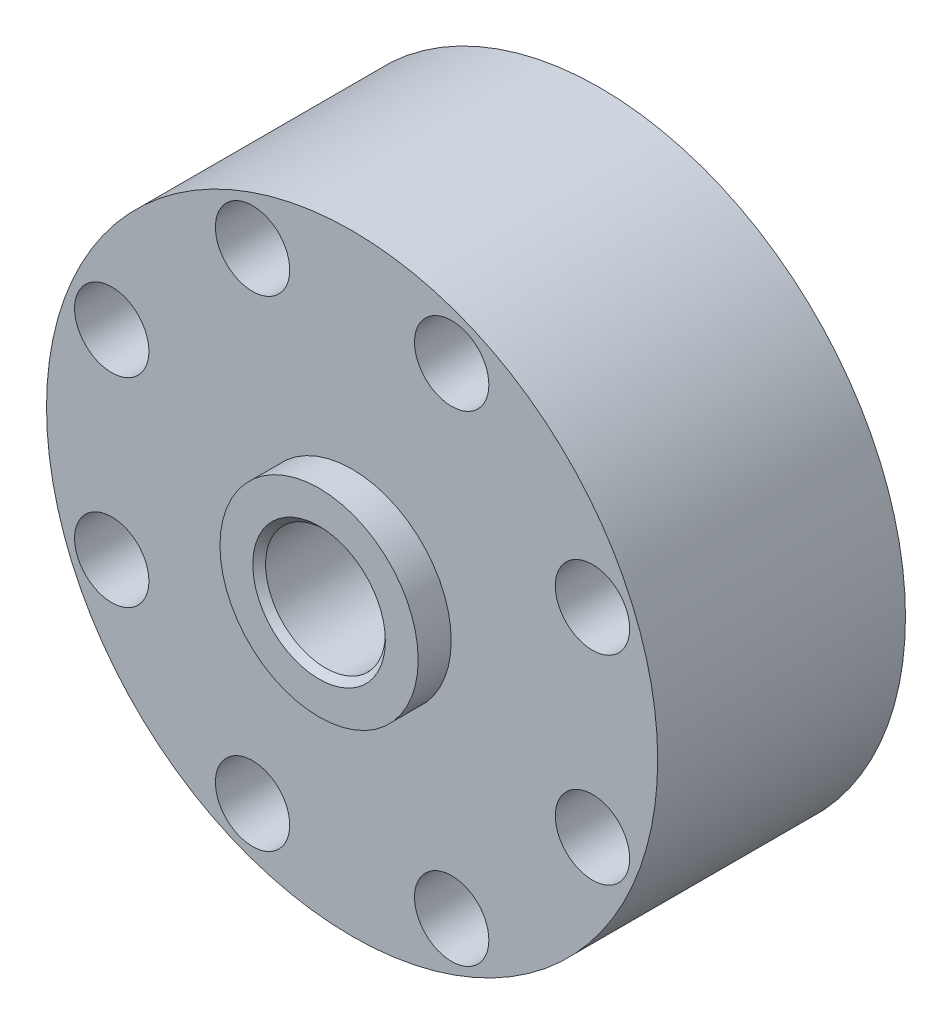
ISO-10303-21;
HEADER;
FILE_DESCRIPTION(('STEP AP214'),'2;1');
FILE_NAME('part.step','',(''),(''),'','','');
FILE_SCHEMA(('AUTOMOTIVE_DESIGN { 1 0 10303 214 1 1 1 1 }'));
ENDSEC;
DATA;
#1=APPLICATION_CONTEXT('core data for automotive mechanical design processes');
#2=APPLICATION_PROTOCOL_DEFINITION('international standard','automotive_design',2000,#1);
#3=PRODUCT_CONTEXT('',#1,'mechanical');
#4=PRODUCT('Part','Part','',(#3));
#5=PRODUCT_RELATED_PRODUCT_CATEGORY('part','',(#4));
#6=PRODUCT_DEFINITION_FORMATION('','',#4);
#7=PRODUCT_DEFINITION_CONTEXT('part definition',#1,'design');
#8=PRODUCT_DEFINITION('design','',#6,#7);
#9=PRODUCT_DEFINITION_SHAPE('','',#8);
#10=(LENGTH_UNIT() NAMED_UNIT(*) SI_UNIT(.MILLI.,.METRE.));
#11=(NAMED_UNIT(*) PLANE_ANGLE_UNIT() SI_UNIT($,.RADIAN.));
#12=(NAMED_UNIT(*) SI_UNIT($,.STERADIAN.) SOLID_ANGLE_UNIT());
#13=UNCERTAINTY_MEASURE_WITH_UNIT(LENGTH_MEASURE(1.E-05),#10,'distance_accuracy_value','');
#14=(GEOMETRIC_REPRESENTATION_CONTEXT(3) GLOBAL_UNCERTAINTY_ASSIGNED_CONTEXT((#13)) GLOBAL_UNIT_ASSIGNED_CONTEXT((#10,
#11,#12)) REPRESENTATION_CONTEXT('',''));
#15=CARTESIAN_POINT('',(0.,0.,0.));
#16=DIRECTION('',(0.,0.,1.));
#17=DIRECTION('',(1.,0.,0.));
#18=AXIS2_PLACEMENT_3D('',#15,#16,#17);
#19=CARTESIAN_POINT('',(0.,0.,30.));
#20=DIRECTION('',(0.,0.,-1.));
#21=DIRECTION('',(-1.,0.,0.));
#22=AXIS2_PLACEMENT_3D('',#19,#20,#21);
#23=CYLINDRICAL_SURFACE('',#22,37.);
#24=CARTESIAN_POINT('',(0.,0.,30.));
#25=DIRECTION('',(0.,0.,1.));
#26=DIRECTION('',(1.,0.,0.));
#27=AXIS2_PLACEMENT_3D('',#24,#25,#26);
#28=CIRCLE('',#27,37.);
#29=CARTESIAN_POINT('',(37.,0.,30.));
#30=VERTEX_POINT('',#29);
#31=EDGE_CURVE('E10',#30,#30,#28,.T.);
#32=ORIENTED_EDGE('',*,*,#31,.F.);
#33=EDGE_LOOP('',(#32));
#34=FACE_BOUND('',#33,.T.);
#35=CARTESIAN_POINT('',(0.,0.,0.));
#36=DIRECTION('',(0.,0.,1.));
#37=DIRECTION('',(1.,0.,0.));
#38=AXIS2_PLACEMENT_3D('',#35,#36,#37);
#39=CIRCLE('',#38,37.);
#40=CARTESIAN_POINT('',(37.,0.,0.));
#41=VERTEX_POINT('',#40);
#42=EDGE_CURVE('E42',#41,#41,#39,.T.);
#43=ORIENTED_EDGE('',*,*,#42,.T.);
#44=EDGE_LOOP('',(#43));
#45=FACE_BOUND('',#44,.T.);
#46=ADVANCED_FACE('F39',(#34,#45),#23,.T.);
#47=CARTESIAN_POINT('',(0.,0.,30.));
#48=DIRECTION('',(0.,0.,1.));
#49=DIRECTION('',(1.,0.,0.));
#50=AXIS2_PLACEMENT_3D('',#47,#48,#49);
#51=PLANE('',#50);
#52=CARTESIAN_POINT('',(0.,0.,30.));
#53=DIRECTION('',(0.,0.,1.));
#54=DIRECTION('',(1.,0.,0.));
#55=AXIS2_PLACEMENT_3D('',#52,#53,#54);
#56=CIRCLE('',#55,12.);
#57=CARTESIAN_POINT('',(12.,0.,30.));
#58=VERTEX_POINT('',#57);
#59=EDGE_CURVE('E147',#58,#58,#56,.T.);
#60=ORIENTED_EDGE('',*,*,#59,.F.);
#61=EDGE_LOOP('',(#60));
#62=FACE_BOUND('',#61,.T.);
#63=CARTESIAN_POINT('',(12.0545281195,29.1022052741057,30.));
#64=DIRECTION('',(0.,0.,1.));
#65=DIRECTION('',(1.,0.,0.));
#66=AXIS2_PLACEMENT_3D('',#63,#64,#65);
#67=CIRCLE('',#66,4.50000000000001);
#68=CARTESIAN_POINT('',(16.5545281195,29.1022052741057,30.));
#69=VERTEX_POINT('',#68);
#70=EDGE_CURVE('E143',#69,#69,#67,.T.);
#71=ORIENTED_EDGE('',*,*,#70,.F.);
#72=EDGE_LOOP('',(#71));
#73=FACE_BOUND('',#72,.T.);
#74=CARTESIAN_POINT('',(29.1022052741054,12.0545281195006,30.));
#75=DIRECTION('',(0.,0.,1.));
#76=DIRECTION('',(1.,0.,0.));
#77=AXIS2_PLACEMENT_3D('',#74,#75,#76);
#78=CIRCLE('',#77,4.50000000000001);
#79=CARTESIAN_POINT('',(33.6022052741054,12.0545281195006,30.));
#80=VERTEX_POINT('',#79);
#81=EDGE_CURVE('E131',#80,#80,#78,.T.);
#82=ORIENTED_EDGE('',*,*,#81,.F.);
#83=EDGE_LOOP('',(#82));
#84=FACE_BOUND('',#83,.T.);
#85=CARTESIAN_POINT('',(29.1022052741056,-12.0545281195001,30.));
#86=DIRECTION('',(0.,0.,1.));
#87=DIRECTION('',(1.,0.,0.));
#88=AXIS2_PLACEMENT_3D('',#85,#86,#87);
#89=CIRCLE('',#88,4.50000000000001);
#90=CARTESIAN_POINT('',(33.6022052741057,-12.0545281195001,30.));
#91=VERTEX_POINT('',#90);
#92=EDGE_CURVE('E119',#91,#91,#89,.T.);
#93=ORIENTED_EDGE('',*,*,#92,.F.);
#94=EDGE_LOOP('',(#93));
#95=FACE_BOUND('',#94,.T.);
#96=CARTESIAN_POINT('',(12.0545281195003,-29.1022052741055,30.));
#97=DIRECTION('',(0.,0.,1.));
#98=DIRECTION('',(1.,0.,0.));
#99=AXIS2_PLACEMENT_3D('',#96,#97,#98);
#100=CIRCLE('',#99,4.50000000000001);
#101=CARTESIAN_POINT('',(16.5545281195004,-29.1022052741055,30.));
#102=VERTEX_POINT('',#101);
#103=EDGE_CURVE('E107',#102,#102,#100,.T.);
#104=ORIENTED_EDGE('',*,*,#103,.F.);
#105=EDGE_LOOP('',(#104));
#106=FACE_BOUND('',#105,.T.);
#107=CARTESIAN_POINT('',(-12.0545281195002,-29.1022052741056,30.));
#108=DIRECTION('',(0.,0.,1.));
#109=DIRECTION('',(1.,0.,0.));
#110=AXIS2_PLACEMENT_3D('',#107,#108,#109);
#111=CIRCLE('',#110,4.50000000000001);
#112=CARTESIAN_POINT('',(-7.55452811950015,-29.1022052741056,30.));
#113=VERTEX_POINT('',#112);
#114=EDGE_CURVE('E95',#113,#113,#111,.T.);
#115=ORIENTED_EDGE('',*,*,#114,.F.);
#116=EDGE_LOOP('',(#115));
#117=FACE_BOUND('',#116,.T.);
#118=CARTESIAN_POINT('',(-29.1022052741055,-12.0545281195004,30.));
#119=DIRECTION('',(0.,0.,1.));
#120=DIRECTION('',(1.,0.,0.));
#121=AXIS2_PLACEMENT_3D('',#118,#119,#120);
#122=CIRCLE('',#121,4.50000000000001);
#123=CARTESIAN_POINT('',(-24.6022052741055,-12.0545281195004,30.));
#124=VERTEX_POINT('',#123);
#125=EDGE_CURVE('E83',#124,#124,#122,.T.);
#126=ORIENTED_EDGE('',*,*,#125,.F.);
#127=EDGE_LOOP('',(#126));
#128=FACE_BOUND('',#127,.T.);
#129=CARTESIAN_POINT('',(-29.1022052741056,12.0545281195003,30.));
#130=DIRECTION('',(0.,0.,1.));
#131=DIRECTION('',(1.,0.,0.));
#132=AXIS2_PLACEMENT_3D('',#129,#130,#131);
#133=CIRCLE('',#132,4.50000000000001);
#134=CARTESIAN_POINT('',(-24.6022052741056,12.0545281195003,30.));
#135=VERTEX_POINT('',#134);
#136=EDGE_CURVE('E71',#135,#135,#133,.T.);
#137=ORIENTED_EDGE('',*,*,#136,.F.);
#138=EDGE_LOOP('',(#137));
#139=FACE_BOUND('',#138,.T.);
#140=CARTESIAN_POINT('',(-12.0545281195003,29.1022052741055,30.));
#141=DIRECTION('',(0.,0.,1.));
#142=DIRECTION('',(1.,0.,0.));
#143=AXIS2_PLACEMENT_3D('',#140,#141,#142);
#144=CIRCLE('',#143,4.50000000000001);
#145=CARTESIAN_POINT('',(-7.55452811950033,29.1022052741055,30.));
#146=VERTEX_POINT('',#145);
#147=EDGE_CURVE('E59',#146,#146,#144,.T.);
#148=ORIENTED_EDGE('',*,*,#147,.F.);
#149=EDGE_LOOP('',(#148));
#150=FACE_BOUND('',#149,.T.);
#151=ORIENTED_EDGE('',*,*,#31,.T.);
#152=EDGE_LOOP('',(#151));
#153=FACE_BOUND('',#152,.T.);
#154=ADVANCED_FACE('F199',(#62,#73,#84,#95,#106,#117,#128,#139,#150,#153),#51,.T.);
#155=CARTESIAN_POINT('',(0.,0.,0.));
#156=DIRECTION('',(0.,0.,1.));
#157=DIRECTION('',(1.,0.,0.));
#158=AXIS2_PLACEMENT_3D('',#155,#156,#157);
#159=PLANE('',#158);
#160=CARTESIAN_POINT('',(0.,0.,0.));
#161=DIRECTION('',(0.,0.,1.));
#162=DIRECTION('',(1.,0.,0.));
#163=AXIS2_PLACEMENT_3D('',#160,#161,#162);
#164=CIRCLE('',#163,8.02499999999999);
#165=CARTESIAN_POINT('',(8.02499999999999,0.,0.));
#166=VERTEX_POINT('',#165);
#167=EDGE_CURVE('E161',#166,#166,#164,.T.);
#168=ORIENTED_EDGE('',*,*,#167,.T.);
#169=EDGE_LOOP('',(#168));
#170=FACE_BOUND('',#169,.T.);
#171=CARTESIAN_POINT('',(12.0545281195,29.1022052741057,0.));
#172=DIRECTION('',(0.,0.,1.));
#173=DIRECTION('',(1.,0.,0.));
#174=AXIS2_PLACEMENT_3D('',#171,#172,#173);
#175=CIRCLE('',#174,3.00000000000001);
#176=CARTESIAN_POINT('',(15.0545281195,29.1022052741057,0.));
#177=VERTEX_POINT('',#176);
#178=EDGE_CURVE('E134',#177,#177,#175,.T.);
#179=ORIENTED_EDGE('',*,*,#178,.T.);
#180=EDGE_LOOP('',(#179));
#181=FACE_BOUND('',#180,.T.);
#182=CARTESIAN_POINT('',(29.1022052741054,12.0545281195006,0.));
#183=DIRECTION('',(0.,0.,1.));
#184=DIRECTION('',(1.,0.,0.));
#185=AXIS2_PLACEMENT_3D('',#182,#183,#184);
#186=CIRCLE('',#185,3.00000000000001);
#187=CARTESIAN_POINT('',(32.1022052741054,12.0545281195006,0.));
#188=VERTEX_POINT('',#187);
#189=EDGE_CURVE('E122',#188,#188,#186,.T.);
#190=ORIENTED_EDGE('',*,*,#189,.T.);
#191=EDGE_LOOP('',(#190));
#192=FACE_BOUND('',#191,.T.);
#193=CARTESIAN_POINT('',(29.1022052741056,-12.0545281195001,0.));
#194=DIRECTION('',(0.,0.,1.));
#195=DIRECTION('',(1.,0.,0.));
#196=AXIS2_PLACEMENT_3D('',#193,#194,#195);
#197=CIRCLE('',#196,3.00000000000001);
#198=CARTESIAN_POINT('',(32.1022052741057,-12.0545281195001,0.));
#199=VERTEX_POINT('',#198);
#200=EDGE_CURVE('E110',#199,#199,#197,.T.);
#201=ORIENTED_EDGE('',*,*,#200,.T.);
#202=EDGE_LOOP('',(#201));
#203=FACE_BOUND('',#202,.T.);
#204=CARTESIAN_POINT('',(12.0545281195003,-29.1022052741055,0.));
#205=DIRECTION('',(0.,0.,1.));
#206=DIRECTION('',(1.,0.,0.));
#207=AXIS2_PLACEMENT_3D('',#204,#205,#206);
#208=CIRCLE('',#207,3.00000000000001);
#209=CARTESIAN_POINT('',(15.0545281195004,-29.1022052741055,0.));
#210=VERTEX_POINT('',#209);
#211=EDGE_CURVE('E98',#210,#210,#208,.T.);
#212=ORIENTED_EDGE('',*,*,#211,.T.);
#213=EDGE_LOOP('',(#212));
#214=FACE_BOUND('',#213,.T.);
#215=CARTESIAN_POINT('',(-12.0545281195002,-29.1022052741056,0.));
#216=DIRECTION('',(0.,0.,1.));
#217=DIRECTION('',(1.,0.,0.));
#218=AXIS2_PLACEMENT_3D('',#215,#216,#217);
#219=CIRCLE('',#218,3.00000000000001);
#220=CARTESIAN_POINT('',(-9.05452811950015,-29.1022052741056,0.));
#221=VERTEX_POINT('',#220);
#222=EDGE_CURVE('E86',#221,#221,#219,.T.);
#223=ORIENTED_EDGE('',*,*,#222,.T.);
#224=EDGE_LOOP('',(#223));
#225=FACE_BOUND('',#224,.T.);
#226=CARTESIAN_POINT('',(-29.1022052741055,-12.0545281195004,0.));
#227=DIRECTION('',(0.,0.,1.));
#228=DIRECTION('',(1.,0.,0.));
#229=AXIS2_PLACEMENT_3D('',#226,#227,#228);
#230=CIRCLE('',#229,3.00000000000001);
#231=CARTESIAN_POINT('',(-26.1022052741055,-12.0545281195004,0.));
#232=VERTEX_POINT('',#231);
#233=EDGE_CURVE('E74',#232,#232,#230,.T.);
#234=ORIENTED_EDGE('',*,*,#233,.T.);
#235=EDGE_LOOP('',(#234));
#236=FACE_BOUND('',#235,.T.);
#237=CARTESIAN_POINT('',(-29.1022052741056,12.0545281195003,0.));
#238=DIRECTION('',(0.,0.,1.));
#239=DIRECTION('',(1.,0.,0.));
#240=AXIS2_PLACEMENT_3D('',#237,#238,#239);
#241=CIRCLE('',#240,3.00000000000001);
#242=CARTESIAN_POINT('',(-26.1022052741056,12.0545281195003,0.));
#243=VERTEX_POINT('',#242);
#244=EDGE_CURVE('E62',#243,#243,#241,.T.);
#245=ORIENTED_EDGE('',*,*,#244,.T.);
#246=EDGE_LOOP('',(#245));
#247=FACE_BOUND('',#246,.T.);
#248=CARTESIAN_POINT('',(-12.0545281195003,29.1022052741055,0.));
#249=DIRECTION('',(0.,0.,1.));
#250=DIRECTION('',(1.,0.,0.));
#251=AXIS2_PLACEMENT_3D('',#248,#249,#250);
#252=CIRCLE('',#251,3.00000000000001);
#253=CARTESIAN_POINT('',(-9.05452811950033,29.1022052741055,0.));
#254=VERTEX_POINT('',#253);
#255=EDGE_CURVE('E49',#254,#254,#252,.T.);
#256=ORIENTED_EDGE('',*,*,#255,.T.);
#257=EDGE_LOOP('',(#256));
#258=FACE_BOUND('',#257,.T.);
#259=ORIENTED_EDGE('',*,*,#42,.F.);
#260=EDGE_LOOP('',(#259));
#261=FACE_BOUND('',#260,.T.);
#262=ADVANCED_FACE('F165',(#170,#181,#192,#203,#214,#225,#236,#247,#258,#261),#159,.F.);
#263=CARTESIAN_POINT('',(-12.0545281195003,29.1022052741055,30.));
#264=DIRECTION('',(0.,0.,1.));
#265=DIRECTION('',(1.,0.,0.));
#266=AXIS2_PLACEMENT_3D('',#263,#264,#265);
#267=CYLINDRICAL_SURFACE('',#266,3.00000000000001);
#268=ORIENTED_EDGE('',*,*,#255,.F.);
#269=EDGE_LOOP('',(#268));
#270=FACE_BOUND('',#269,.T.);
#271=CARTESIAN_POINT('',(-12.0545281195003,29.1022052741055,23.));
#272=DIRECTION('',(0.,0.,1.));
#273=DIRECTION('',(1.,0.,0.));
#274=AXIS2_PLACEMENT_3D('',#271,#272,#273);
#275=CIRCLE('',#274,3.00000000000001);
#276=CARTESIAN_POINT('',(-9.05452811950033,29.1022052741055,23.));
#277=VERTEX_POINT('',#276);
#278=EDGE_CURVE('E53',#277,#277,#275,.T.);
#279=ORIENTED_EDGE('',*,*,#278,.T.);
#280=EDGE_LOOP('',(#279));
#281=FACE_BOUND('',#280,.T.);
#282=ADVANCED_FACE('F232',(#270,#281),#267,.F.);
#283=CARTESIAN_POINT('',(-9.05452811950033,29.1022052741055,23.));
#284=DIRECTION('',(0.,0.,-1.));
#285=DIRECTION('',(-1.,0.,0.));
#286=AXIS2_PLACEMENT_3D('',#283,#284,#285);
#287=PLANE('',#286);
#288=ORIENTED_EDGE('',*,*,#278,.F.);
#289=EDGE_LOOP('',(#288));
#290=FACE_BOUND('',#289,.T.);
#291=CARTESIAN_POINT('',(-12.0545281195003,29.1022052741055,23.));
#292=DIRECTION('',(0.,0.,1.));
#293=DIRECTION('',(1.,0.,0.));
#294=AXIS2_PLACEMENT_3D('',#291,#292,#293);
#295=CIRCLE('',#294,4.50000000000001);
#296=CARTESIAN_POINT('',(-7.55452811950033,29.1022052741055,23.));
#297=VERTEX_POINT('',#296);
#298=EDGE_CURVE('E56',#297,#297,#295,.T.);
#299=ORIENTED_EDGE('',*,*,#298,.T.);
#300=EDGE_LOOP('',(#299));
#301=FACE_BOUND('',#300,.T.);
#302=ADVANCED_FACE('F222',(#290,#301),#287,.F.);
#303=CARTESIAN_POINT('',(-12.0545281195003,29.1022052741055,30.));
#304=DIRECTION('',(0.,0.,1.));
#305=DIRECTION('',(1.,0.,0.));
#306=AXIS2_PLACEMENT_3D('',#303,#304,#305);
#307=CYLINDRICAL_SURFACE('',#306,4.50000000000001);
#308=ORIENTED_EDGE('',*,*,#298,.F.);
#309=EDGE_LOOP('',(#308));
#310=FACE_BOUND('',#309,.T.);
#311=ORIENTED_EDGE('',*,*,#147,.T.);
#312=EDGE_LOOP('',(#311));
#313=FACE_BOUND('',#312,.T.);
#314=ADVANCED_FACE('F219',(#310,#313),#307,.F.);
#315=CARTESIAN_POINT('',(-29.1022052741056,12.0545281195003,30.));
#316=DIRECTION('',(0.,0.,1.));
#317=DIRECTION('',(1.,0.,0.));
#318=AXIS2_PLACEMENT_3D('',#315,#316,#317);
#319=CYLINDRICAL_SURFACE('',#318,3.00000000000001);
#320=ORIENTED_EDGE('',*,*,#244,.F.);
#321=EDGE_LOOP('',(#320));
#322=FACE_BOUND('',#321,.T.);
#323=CARTESIAN_POINT('',(-29.1022052741056,12.0545281195003,23.));
#324=DIRECTION('',(0.,0.,1.));
#325=DIRECTION('',(1.,0.,0.));
#326=AXIS2_PLACEMENT_3D('',#323,#324,#325);
#327=CIRCLE('',#326,3.00000000000001);
#328=CARTESIAN_POINT('',(-26.1022052741056,12.0545281195003,23.));
#329=VERTEX_POINT('',#328);
#330=EDGE_CURVE('E65',#329,#329,#327,.T.);
#331=ORIENTED_EDGE('',*,*,#330,.T.);
#332=EDGE_LOOP('',(#331));
#333=FACE_BOUND('',#332,.T.);
#334=ADVANCED_FACE('F221',(#322,#333),#319,.F.);
#335=CARTESIAN_POINT('',(-26.1022052741056,12.0545281195003,23.));
#336=DIRECTION('',(0.,0.,-1.));
#337=DIRECTION('',(-1.,0.,0.));
#338=AXIS2_PLACEMENT_3D('',#335,#336,#337);
#339=PLANE('',#338);
#340=ORIENTED_EDGE('',*,*,#330,.F.);
#341=EDGE_LOOP('',(#340));
#342=FACE_BOUND('',#341,.T.);
#343=CARTESIAN_POINT('',(-29.1022052741056,12.0545281195003,23.));
#344=DIRECTION('',(0.,0.,1.));
#345=DIRECTION('',(1.,0.,0.));
#346=AXIS2_PLACEMENT_3D('',#343,#344,#345);
#347=CIRCLE('',#346,4.50000000000001);
#348=CARTESIAN_POINT('',(-24.6022052741056,12.0545281195003,23.));
#349=VERTEX_POINT('',#348);
#350=EDGE_CURVE('E68',#349,#349,#347,.T.);
#351=ORIENTED_EDGE('',*,*,#350,.T.);
#352=EDGE_LOOP('',(#351));
#353=FACE_BOUND('',#352,.T.);
#354=ADVANCED_FACE('F229',(#342,#353),#339,.F.);
#355=CARTESIAN_POINT('',(-29.1022052741056,12.0545281195003,30.));
#356=DIRECTION('',(0.,0.,1.));
#357=DIRECTION('',(1.,0.,0.));
#358=AXIS2_PLACEMENT_3D('',#355,#356,#357);
#359=CYLINDRICAL_SURFACE('',#358,4.50000000000001);
#360=ORIENTED_EDGE('',*,*,#350,.F.);
#361=EDGE_LOOP('',(#360));
#362=FACE_BOUND('',#361,.T.);
#363=ORIENTED_EDGE('',*,*,#136,.T.);
#364=EDGE_LOOP('',(#363));
#365=FACE_BOUND('',#364,.T.);
#366=ADVANCED_FACE('F279',(#362,#365),#359,.F.);
#367=CARTESIAN_POINT('',(-29.1022052741055,-12.0545281195004,30.));
#368=DIRECTION('',(0.,0.,1.));
#369=DIRECTION('',(1.,0.,0.));
#370=AXIS2_PLACEMENT_3D('',#367,#368,#369);
#371=CYLINDRICAL_SURFACE('',#370,3.00000000000001);
#372=ORIENTED_EDGE('',*,*,#233,.F.);
#373=EDGE_LOOP('',(#372));
#374=FACE_BOUND('',#373,.T.);
#375=CARTESIAN_POINT('',(-29.1022052741055,-12.0545281195004,23.));
#376=DIRECTION('',(0.,0.,1.));
#377=DIRECTION('',(1.,0.,0.));
#378=AXIS2_PLACEMENT_3D('',#375,#376,#377);
#379=CIRCLE('',#378,3.00000000000001);
#380=CARTESIAN_POINT('',(-26.1022052741055,-12.0545281195004,23.));
#381=VERTEX_POINT('',#380);
#382=EDGE_CURVE('E77',#381,#381,#379,.T.);
#383=ORIENTED_EDGE('',*,*,#382,.T.);
#384=EDGE_LOOP('',(#383));
#385=FACE_BOUND('',#384,.T.);
#386=ADVANCED_FACE('F289',(#374,#385),#371,.F.);
#387=CARTESIAN_POINT('',(-26.1022052741055,-12.0545281195004,23.));
#388=DIRECTION('',(0.,0.,-1.));
#389=DIRECTION('',(-1.,0.,0.));
#390=AXIS2_PLACEMENT_3D('',#387,#388,#389);
#391=PLANE('',#390);
#392=ORIENTED_EDGE('',*,*,#382,.F.);
#393=EDGE_LOOP('',(#392));
#394=FACE_BOUND('',#393,.T.);
#395=CARTESIAN_POINT('',(-29.1022052741055,-12.0545281195004,23.));
#396=DIRECTION('',(0.,0.,1.));
#397=DIRECTION('',(1.,0.,0.));
#398=AXIS2_PLACEMENT_3D('',#395,#396,#397);
#399=CIRCLE('',#398,4.50000000000001);
#400=CARTESIAN_POINT('',(-24.6022052741055,-12.0545281195004,23.));
#401=VERTEX_POINT('',#400);
#402=EDGE_CURVE('E80',#401,#401,#399,.T.);
#403=ORIENTED_EDGE('',*,*,#402,.T.);
#404=EDGE_LOOP('',(#403));
#405=FACE_BOUND('',#404,.T.);
#406=ADVANCED_FACE('F299',(#394,#405),#391,.F.);
#407=CARTESIAN_POINT('',(-29.1022052741055,-12.0545281195004,30.));
#408=DIRECTION('',(0.,0.,1.));
#409=DIRECTION('',(1.,0.,0.));
#410=AXIS2_PLACEMENT_3D('',#407,#408,#409);
#411=CYLINDRICAL_SURFACE('',#410,4.50000000000001);
#412=ORIENTED_EDGE('',*,*,#402,.F.);
#413=EDGE_LOOP('',(#412));
#414=FACE_BOUND('',#413,.T.);
#415=ORIENTED_EDGE('',*,*,#125,.T.);
#416=EDGE_LOOP('',(#415));
#417=FACE_BOUND('',#416,.T.);
#418=ADVANCED_FACE('F309',(#414,#417),#411,.F.);
#419=CARTESIAN_POINT('',(-12.0545281195002,-29.1022052741056,30.));
#420=DIRECTION('',(0.,0.,1.));
#421=DIRECTION('',(1.,0.,0.));
#422=AXIS2_PLACEMENT_3D('',#419,#420,#421);
#423=CYLINDRICAL_SURFACE('',#422,3.00000000000001);
#424=ORIENTED_EDGE('',*,*,#222,.F.);
#425=EDGE_LOOP('',(#424));
#426=FACE_BOUND('',#425,.T.);
#427=CARTESIAN_POINT('',(-12.0545281195002,-29.1022052741056,23.));
#428=DIRECTION('',(0.,0.,1.));
#429=DIRECTION('',(1.,0.,0.));
#430=AXIS2_PLACEMENT_3D('',#427,#428,#429);
#431=CIRCLE('',#430,3.00000000000001);
#432=CARTESIAN_POINT('',(-9.05452811950014,-29.1022052741056,23.));
#433=VERTEX_POINT('',#432);
#434=EDGE_CURVE('E89',#433,#433,#431,.T.);
#435=ORIENTED_EDGE('',*,*,#434,.T.);
#436=EDGE_LOOP('',(#435));
#437=FACE_BOUND('',#436,.T.);
#438=ADVANCED_FACE('F319',(#426,#437),#423,.F.);
#439=CARTESIAN_POINT('',(-9.05452811950014,-29.1022052741056,23.));
#440=DIRECTION('',(0.,0.,-1.));
#441=DIRECTION('',(-1.,0.,0.));
#442=AXIS2_PLACEMENT_3D('',#439,#440,#441);
#443=PLANE('',#442);
#444=ORIENTED_EDGE('',*,*,#434,.F.);
#445=EDGE_LOOP('',(#444));
#446=FACE_BOUND('',#445,.T.);
#447=CARTESIAN_POINT('',(-12.0545281195002,-29.1022052741056,23.));
#448=DIRECTION('',(0.,0.,1.));
#449=DIRECTION('',(1.,0.,0.));
#450=AXIS2_PLACEMENT_3D('',#447,#448,#449);
#451=CIRCLE('',#450,4.50000000000001);
#452=CARTESIAN_POINT('',(-7.55452811950015,-29.1022052741056,23.));
#453=VERTEX_POINT('',#452);
#454=EDGE_CURVE('E92',#453,#453,#451,.T.);
#455=ORIENTED_EDGE('',*,*,#454,.T.);
#456=EDGE_LOOP('',(#455));
#457=FACE_BOUND('',#456,.T.);
#458=ADVANCED_FACE('F329',(#446,#457),#443,.F.);
#459=CARTESIAN_POINT('',(-12.0545281195002,-29.1022052741056,30.));
#460=DIRECTION('',(0.,0.,1.));
#461=DIRECTION('',(1.,0.,0.));
#462=AXIS2_PLACEMENT_3D('',#459,#460,#461);
#463=CYLINDRICAL_SURFACE('',#462,4.50000000000001);
#464=ORIENTED_EDGE('',*,*,#454,.F.);
#465=EDGE_LOOP('',(#464));
#466=FACE_BOUND('',#465,.T.);
#467=ORIENTED_EDGE('',*,*,#114,.T.);
#468=EDGE_LOOP('',(#467));
#469=FACE_BOUND('',#468,.T.);
#470=ADVANCED_FACE('F339',(#466,#469),#463,.F.);
#471=CARTESIAN_POINT('',(12.0545281195003,-29.1022052741055,30.));
#472=DIRECTION('',(0.,0.,1.));
#473=DIRECTION('',(1.,0.,0.));
#474=AXIS2_PLACEMENT_3D('',#471,#472,#473);
#475=CYLINDRICAL_SURFACE('',#474,3.00000000000001);
#476=ORIENTED_EDGE('',*,*,#211,.F.);
#477=EDGE_LOOP('',(#476));
#478=FACE_BOUND('',#477,.T.);
#479=CARTESIAN_POINT('',(12.0545281195003,-29.1022052741055,23.));
#480=DIRECTION('',(0.,0.,1.));
#481=DIRECTION('',(1.,0.,0.));
#482=AXIS2_PLACEMENT_3D('',#479,#480,#481);
#483=CIRCLE('',#482,3.00000000000001);
#484=CARTESIAN_POINT('',(15.0545281195004,-29.1022052741055,23.));
#485=VERTEX_POINT('',#484);
#486=EDGE_CURVE('E101',#485,#485,#483,.T.);
#487=ORIENTED_EDGE('',*,*,#486,.T.);
#488=EDGE_LOOP('',(#487));
#489=FACE_BOUND('',#488,.T.);
#490=ADVANCED_FACE('F349',(#478,#489),#475,.F.);
#491=CARTESIAN_POINT('',(15.0545281195004,-29.1022052741055,23.));
#492=DIRECTION('',(0.,0.,-1.));
#493=DIRECTION('',(-1.,0.,0.));
#494=AXIS2_PLACEMENT_3D('',#491,#492,#493);
#495=PLANE('',#494);
#496=ORIENTED_EDGE('',*,*,#486,.F.);
#497=EDGE_LOOP('',(#496));
#498=FACE_BOUND('',#497,.T.);
#499=CARTESIAN_POINT('',(12.0545281195003,-29.1022052741055,23.));
#500=DIRECTION('',(0.,0.,1.));
#501=DIRECTION('',(1.,0.,0.));
#502=AXIS2_PLACEMENT_3D('',#499,#500,#501);
#503=CIRCLE('',#502,4.50000000000001);
#504=CARTESIAN_POINT('',(16.5545281195004,-29.1022052741055,23.));
#505=VERTEX_POINT('',#504);
#506=EDGE_CURVE('E104',#505,#505,#503,.T.);
#507=ORIENTED_EDGE('',*,*,#506,.T.);
#508=EDGE_LOOP('',(#507));
#509=FACE_BOUND('',#508,.T.);
#510=ADVANCED_FACE('F359',(#498,#509),#495,.F.);
#511=CARTESIAN_POINT('',(12.0545281195003,-29.1022052741055,30.));
#512=DIRECTION('',(0.,0.,1.));
#513=DIRECTION('',(1.,0.,0.));
#514=AXIS2_PLACEMENT_3D('',#511,#512,#513);
#515=CYLINDRICAL_SURFACE('',#514,4.50000000000001);
#516=ORIENTED_EDGE('',*,*,#506,.F.);
#517=EDGE_LOOP('',(#516));
#518=FACE_BOUND('',#517,.T.);
#519=ORIENTED_EDGE('',*,*,#103,.T.);
#520=EDGE_LOOP('',(#519));
#521=FACE_BOUND('',#520,.T.);
#522=ADVANCED_FACE('F369',(#518,#521),#515,.F.);
#523=CARTESIAN_POINT('',(29.1022052741056,-12.0545281195001,30.));
#524=DIRECTION('',(0.,0.,1.));
#525=DIRECTION('',(1.,0.,0.));
#526=AXIS2_PLACEMENT_3D('',#523,#524,#525);
#527=CYLINDRICAL_SURFACE('',#526,3.00000000000001);
#528=ORIENTED_EDGE('',*,*,#200,.F.);
#529=EDGE_LOOP('',(#528));
#530=FACE_BOUND('',#529,.T.);
#531=CARTESIAN_POINT('',(29.1022052741056,-12.0545281195001,23.));
#532=DIRECTION('',(0.,0.,1.));
#533=DIRECTION('',(1.,0.,0.));
#534=AXIS2_PLACEMENT_3D('',#531,#532,#533);
#535=CIRCLE('',#534,3.00000000000001);
#536=CARTESIAN_POINT('',(32.1022052741057,-12.0545281195001,23.));
#537=VERTEX_POINT('',#536);
#538=EDGE_CURVE('E113',#537,#537,#535,.T.);
#539=ORIENTED_EDGE('',*,*,#538,.T.);
#540=EDGE_LOOP('',(#539));
#541=FACE_BOUND('',#540,.T.);
#542=ADVANCED_FACE('F379',(#530,#541),#527,.F.);
#543=CARTESIAN_POINT('',(32.1022052741057,-12.0545281195001,23.));
#544=DIRECTION('',(0.,0.,-1.));
#545=DIRECTION('',(-1.,0.,0.));
#546=AXIS2_PLACEMENT_3D('',#543,#544,#545);
#547=PLANE('',#546);
#548=ORIENTED_EDGE('',*,*,#538,.F.);
#549=EDGE_LOOP('',(#548));
#550=FACE_BOUND('',#549,.T.);
#551=CARTESIAN_POINT('',(29.1022052741056,-12.0545281195001,23.));
#552=DIRECTION('',(0.,0.,1.));
#553=DIRECTION('',(1.,0.,0.));
#554=AXIS2_PLACEMENT_3D('',#551,#552,#553);
#555=CIRCLE('',#554,4.50000000000001);
#556=CARTESIAN_POINT('',(33.6022052741057,-12.0545281195001,23.));
#557=VERTEX_POINT('',#556);
#558=EDGE_CURVE('E116',#557,#557,#555,.T.);
#559=ORIENTED_EDGE('',*,*,#558,.T.);
#560=EDGE_LOOP('',(#559));
#561=FACE_BOUND('',#560,.T.);
#562=ADVANCED_FACE('F389',(#550,#561),#547,.F.);
#563=CARTESIAN_POINT('',(29.1022052741056,-12.0545281195001,30.));
#564=DIRECTION('',(0.,0.,1.));
#565=DIRECTION('',(1.,0.,0.));
#566=AXIS2_PLACEMENT_3D('',#563,#564,#565);
#567=CYLINDRICAL_SURFACE('',#566,4.50000000000001);
#568=ORIENTED_EDGE('',*,*,#558,.F.);
#569=EDGE_LOOP('',(#568));
#570=FACE_BOUND('',#569,.T.);
#571=ORIENTED_EDGE('',*,*,#92,.T.);
#572=EDGE_LOOP('',(#571));
#573=FACE_BOUND('',#572,.T.);
#574=ADVANCED_FACE('F399',(#570,#573),#567,.F.);
#575=CARTESIAN_POINT('',(29.1022052741054,12.0545281195006,30.));
#576=DIRECTION('',(0.,0.,1.));
#577=DIRECTION('',(1.,0.,0.));
#578=AXIS2_PLACEMENT_3D('',#575,#576,#577);
#579=CYLINDRICAL_SURFACE('',#578,3.00000000000001);
#580=ORIENTED_EDGE('',*,*,#189,.F.);
#581=EDGE_LOOP('',(#580));
#582=FACE_BOUND('',#581,.T.);
#583=CARTESIAN_POINT('',(29.1022052741054,12.0545281195006,23.));
#584=DIRECTION('',(0.,0.,1.));
#585=DIRECTION('',(1.,0.,0.));
#586=AXIS2_PLACEMENT_3D('',#583,#584,#585);
#587=CIRCLE('',#586,3.00000000000001);
#588=CARTESIAN_POINT('',(32.1022052741054,12.0545281195006,23.));
#589=VERTEX_POINT('',#588);
#590=EDGE_CURVE('E125',#589,#589,#587,.T.);
#591=ORIENTED_EDGE('',*,*,#590,.T.);
#592=EDGE_LOOP('',(#591));
#593=FACE_BOUND('',#592,.T.);
#594=ADVANCED_FACE('F409',(#582,#593),#579,.F.);
#595=CARTESIAN_POINT('',(32.1022052741054,12.0545281195006,23.));
#596=DIRECTION('',(0.,0.,-1.));
#597=DIRECTION('',(-1.,0.,0.));
#598=AXIS2_PLACEMENT_3D('',#595,#596,#597);
#599=PLANE('',#598);
#600=ORIENTED_EDGE('',*,*,#590,.F.);
#601=EDGE_LOOP('',(#600));
#602=FACE_BOUND('',#601,.T.);
#603=CARTESIAN_POINT('',(29.1022052741054,12.0545281195006,23.));
#604=DIRECTION('',(0.,0.,1.));
#605=DIRECTION('',(1.,0.,0.));
#606=AXIS2_PLACEMENT_3D('',#603,#604,#605);
#607=CIRCLE('',#606,4.50000000000001);
#608=CARTESIAN_POINT('',(33.6022052741054,12.0545281195006,23.));
#609=VERTEX_POINT('',#608);
#610=EDGE_CURVE('E128',#609,#609,#607,.T.);
#611=ORIENTED_EDGE('',*,*,#610,.T.);
#612=EDGE_LOOP('',(#611));
#613=FACE_BOUND('',#612,.T.);
#614=ADVANCED_FACE('F419',(#602,#613),#599,.F.);
#615=CARTESIAN_POINT('',(29.1022052741054,12.0545281195006,30.));
#616=DIRECTION('',(0.,0.,1.));
#617=DIRECTION('',(1.,0.,0.));
#618=AXIS2_PLACEMENT_3D('',#615,#616,#617);
#619=CYLINDRICAL_SURFACE('',#618,4.50000000000001);
#620=ORIENTED_EDGE('',*,*,#610,.F.);
#621=EDGE_LOOP('',(#620));
#622=FACE_BOUND('',#621,.T.);
#623=ORIENTED_EDGE('',*,*,#81,.T.);
#624=EDGE_LOOP('',(#623));
#625=FACE_BOUND('',#624,.T.);
#626=ADVANCED_FACE('F429',(#622,#625),#619,.F.);
#627=CARTESIAN_POINT('',(12.0545281195,29.1022052741057,30.));
#628=DIRECTION('',(0.,0.,1.));
#629=DIRECTION('',(1.,0.,0.));
#630=AXIS2_PLACEMENT_3D('',#627,#628,#629);
#631=CYLINDRICAL_SURFACE('',#630,3.00000000000001);
#632=ORIENTED_EDGE('',*,*,#178,.F.);
#633=EDGE_LOOP('',(#632));
#634=FACE_BOUND('',#633,.T.);
#635=CARTESIAN_POINT('',(12.0545281195,29.1022052741057,23.));
#636=DIRECTION('',(0.,0.,1.));
#637=DIRECTION('',(1.,0.,0.));
#638=AXIS2_PLACEMENT_3D('',#635,#636,#637);
#639=CIRCLE('',#638,3.00000000000001);
#640=CARTESIAN_POINT('',(15.0545281195,29.1022052741057,23.));
#641=VERTEX_POINT('',#640);
#642=EDGE_CURVE('E137',#641,#641,#639,.T.);
#643=ORIENTED_EDGE('',*,*,#642,.T.);
#644=EDGE_LOOP('',(#643));
#645=FACE_BOUND('',#644,.T.);
#646=ADVANCED_FACE('F439',(#634,#645),#631,.F.);
#647=CARTESIAN_POINT('',(15.0545281195,29.1022052741057,23.));
#648=DIRECTION('',(0.,0.,-1.));
#649=DIRECTION('',(-1.,0.,0.));
#650=AXIS2_PLACEMENT_3D('',#647,#648,#649);
#651=PLANE('',#650);
#652=ORIENTED_EDGE('',*,*,#642,.F.);
#653=EDGE_LOOP('',(#652));
#654=FACE_BOUND('',#653,.T.);
#655=CARTESIAN_POINT('',(12.0545281195,29.1022052741057,23.));
#656=DIRECTION('',(0.,0.,1.));
#657=DIRECTION('',(1.,0.,0.));
#658=AXIS2_PLACEMENT_3D('',#655,#656,#657);
#659=CIRCLE('',#658,4.50000000000001);
#660=CARTESIAN_POINT('',(16.5545281195,29.1022052741057,23.));
#661=VERTEX_POINT('',#660);
#662=EDGE_CURVE('E140',#661,#661,#659,.T.);
#663=ORIENTED_EDGE('',*,*,#662,.T.);
#664=EDGE_LOOP('',(#663));
#665=FACE_BOUND('',#664,.T.);
#666=ADVANCED_FACE('F449',(#654,#665),#651,.F.);
#667=CARTESIAN_POINT('',(12.0545281195,29.1022052741057,30.));
#668=DIRECTION('',(0.,0.,1.));
#669=DIRECTION('',(1.,0.,0.));
#670=AXIS2_PLACEMENT_3D('',#667,#668,#669);
#671=CYLINDRICAL_SURFACE('',#670,4.50000000000001);
#672=ORIENTED_EDGE('',*,*,#662,.F.);
#673=EDGE_LOOP('',(#672));
#674=FACE_BOUND('',#673,.T.);
#675=ORIENTED_EDGE('',*,*,#70,.T.);
#676=EDGE_LOOP('',(#675));
#677=FACE_BOUND('',#676,.T.);
#678=ADVANCED_FACE('F195',(#674,#677),#671,.F.);
#679=CARTESIAN_POINT('',(0.,0.,34.));
#680=DIRECTION('',(0.,0.,-1.));
#681=DIRECTION('',(-1.,0.,0.));
#682=AXIS2_PLACEMENT_3D('',#679,#680,#681);
#683=CYLINDRICAL_SURFACE('',#682,12.);
#684=CARTESIAN_POINT('',(0.,0.,34.));
#685=DIRECTION('',(0.,0.,1.));
#686=DIRECTION('',(1.,0.,0.));
#687=AXIS2_PLACEMENT_3D('',#684,#685,#686);
#688=CIRCLE('',#687,12.);
#689=CARTESIAN_POINT('',(12.,0.,34.));
#690=VERTEX_POINT('',#689);
#691=EDGE_CURVE('E146',#690,#690,#688,.T.);
#692=ORIENTED_EDGE('',*,*,#691,.F.);
#693=EDGE_LOOP('',(#692));
#694=FACE_BOUND('',#693,.T.);
#695=ORIENTED_EDGE('',*,*,#59,.T.);
#696=EDGE_LOOP('',(#695));
#697=FACE_BOUND('',#696,.T.);
#698=ADVANCED_FACE('F189',(#694,#697),#683,.T.);
#699=CARTESIAN_POINT('',(0.,0.,34.));
#700=DIRECTION('',(0.,0.,1.));
#701=DIRECTION('',(1.,0.,0.));
#702=AXIS2_PLACEMENT_3D('',#699,#700,#701);
#703=PLANE('',#702);
#704=CARTESIAN_POINT('',(0.,0.,34.));
#705=DIRECTION('',(0.,0.,1.));
#706=DIRECTION('',(1.,0.,0.));
#707=AXIS2_PLACEMENT_3D('',#704,#705,#706);
#708=CIRCLE('',#707,8.025);
#709=CARTESIAN_POINT('',(8.025,0.,34.));
#710=VERTEX_POINT('',#709);
#711=EDGE_CURVE('E158',#710,#710,#708,.T.);
#712=ORIENTED_EDGE('',*,*,#711,.F.);
#713=EDGE_LOOP('',(#712));
#714=FACE_BOUND('',#713,.T.);
#715=ORIENTED_EDGE('',*,*,#691,.T.);
#716=EDGE_LOOP('',(#715));
#717=FACE_BOUND('',#716,.T.);
#718=ADVANCED_FACE('F172',(#714,#717),#703,.T.);
#719=CARTESIAN_POINT('',(0.,0.,0.775000000000005));
#720=DIRECTION('',(0.,0.,-1.));
#721=DIRECTION('',(-1.,0.,0.));
#722=AXIS2_PLACEMENT_3D('',#719,#720,#721);
#723=CONICAL_SURFACE('',#722,7.24999999999999,0.785398163397446);
#724=ORIENTED_EDGE('',*,*,#167,.F.);
#725=EDGE_LOOP('',(#724));
#726=FACE_BOUND('',#725,.T.);
#727=CARTESIAN_POINT('',(0.,0.,0.775000000000005));
#728=DIRECTION('',(0.,0.,1.));
#729=DIRECTION('',(1.,0.,0.));
#730=AXIS2_PLACEMENT_3D('',#727,#728,#729);
#731=CIRCLE('',#730,7.24999999999999);
#732=CARTESIAN_POINT('',(7.24999999999999,0.,0.775000000000005));
#733=VERTEX_POINT('',#732);
#734=EDGE_CURVE('E150',#733,#733,#731,.T.);
#735=ORIENTED_EDGE('',*,*,#734,.T.);
#736=EDGE_LOOP('',(#735));
#737=FACE_BOUND('',#736,.T.);
#738=ADVANCED_FACE('F168',(#726,#737),#723,.F.);
#739=CARTESIAN_POINT('',(0.,0.,34.));
#740=DIRECTION('',(0.,0.,1.));
#741=DIRECTION('',(1.,0.,0.));
#742=AXIS2_PLACEMENT_3D('',#739,#740,#741);
#743=CYLINDRICAL_SURFACE('',#742,7.24999999999999);
#744=ORIENTED_EDGE('',*,*,#734,.F.);
#745=EDGE_LOOP('',(#744));
#746=FACE_BOUND('',#745,.T.);
#747=CARTESIAN_POINT('',(0.,0.,33.225));
#748=DIRECTION('',(0.,0.,1.));
#749=DIRECTION('',(1.,0.,0.));
#750=AXIS2_PLACEMENT_3D('',#747,#748,#749);
#751=CIRCLE('',#750,7.25);
#752=CARTESIAN_POINT('',(7.25,0.,33.225));
#753=VERTEX_POINT('',#752);
#754=EDGE_CURVE('E155',#753,#753,#751,.T.);
#755=ORIENTED_EDGE('',*,*,#754,.T.);
#756=EDGE_LOOP('',(#755));
#757=FACE_BOUND('',#756,.T.);
#758=ADVANCED_FACE('F171',(#746,#757),#743,.F.);
#759=CARTESIAN_POINT('',(0.,0.,34.));
#760=DIRECTION('',(0.,0.,1.));
#761=DIRECTION('',(1.,0.,0.));
#762=AXIS2_PLACEMENT_3D('',#759,#760,#761);
#763=CONICAL_SURFACE('',#762,8.025,0.785398163397448);
#764=ORIENTED_EDGE('',*,*,#754,.F.);
#765=EDGE_LOOP('',(#764));
#766=FACE_BOUND('',#765,.T.);
#767=ORIENTED_EDGE('',*,*,#711,.T.);
#768=EDGE_LOOP('',(#767));
#769=FACE_BOUND('',#768,.T.);
#770=ADVANCED_FACE('F178',(#766,#769),#763,.F.);
#771=CLOSED_SHELL('',(#46,#154,#262,#282,#302,#314,#334,#354,#366,#386,#406,#418,#438,#458,#470,
#490,#510,#522,#542,#562,#574,#594,#614,#626,#646,#666,#678,#698,#718,#738,#758,#770));
#772=MANIFOLD_SOLID_BREP('B2',#771);
#773=ADVANCED_BREP_SHAPE_REPRESENTATION('',(#18,#772),#14);
#774=SHAPE_DEFINITION_REPRESENTATION(#9,#773);
ENDSEC;
END-ISO-10303-21;
